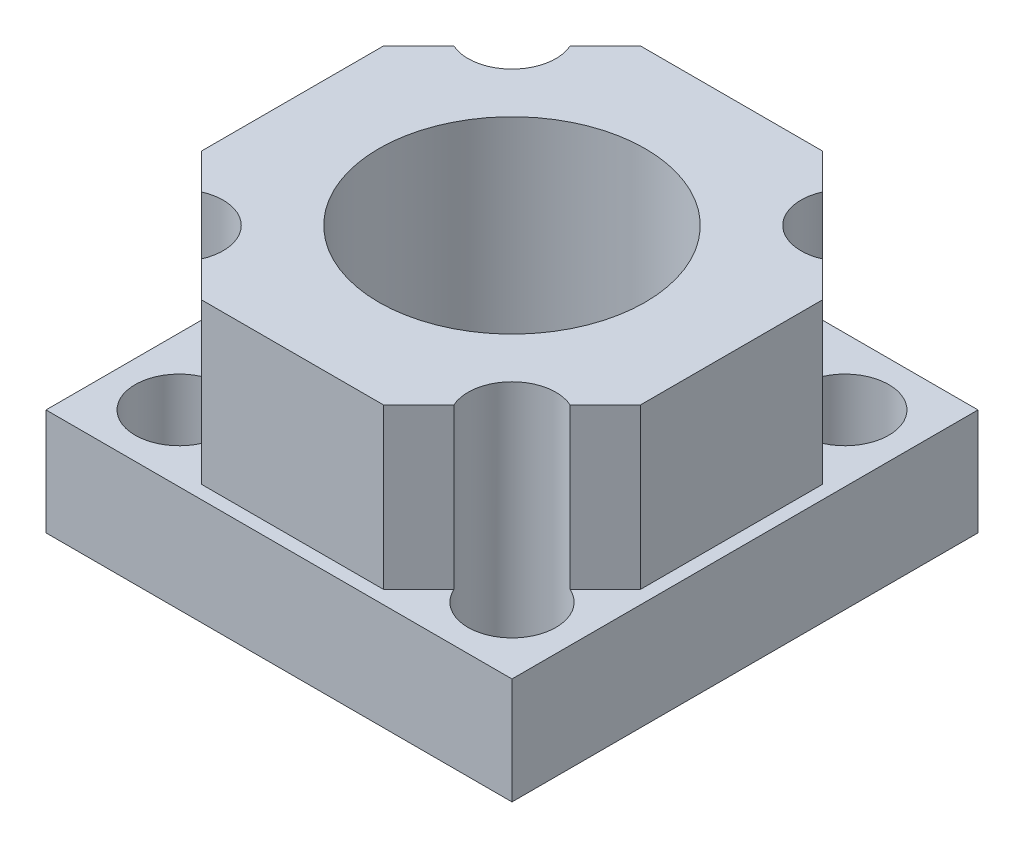
ISO-10303-21;
HEADER;
FILE_DESCRIPTION(('STEP AP214'),'2;1');
FILE_NAME('part.step','',(''),(''),'','','');
FILE_SCHEMA(('AUTOMOTIVE_DESIGN { 1 0 10303 214 1 1 1 1 }'));
ENDSEC;
DATA;
#1=APPLICATION_CONTEXT('core data for automotive mechanical design processes');
#2=APPLICATION_PROTOCOL_DEFINITION('international standard','automotive_design',2000,#1);
#3=PRODUCT_CONTEXT('',#1,'mechanical');
#4=PRODUCT('Part','Part','',(#3));
#5=PRODUCT_RELATED_PRODUCT_CATEGORY('part','',(#4));
#6=PRODUCT_DEFINITION_FORMATION('','',#4);
#7=PRODUCT_DEFINITION_CONTEXT('part definition',#1,'design');
#8=PRODUCT_DEFINITION('design','',#6,#7);
#9=PRODUCT_DEFINITION_SHAPE('','',#8);
#10=(LENGTH_UNIT() NAMED_UNIT(*) SI_UNIT(.MILLI.,.METRE.));
#11=(NAMED_UNIT(*) PLANE_ANGLE_UNIT() SI_UNIT($,.RADIAN.));
#12=(NAMED_UNIT(*) SI_UNIT($,.STERADIAN.) SOLID_ANGLE_UNIT());
#13=UNCERTAINTY_MEASURE_WITH_UNIT(LENGTH_MEASURE(1.E-05),#10,'distance_accuracy_value','');
#14=(GEOMETRIC_REPRESENTATION_CONTEXT(3) GLOBAL_UNCERTAINTY_ASSIGNED_CONTEXT((#13)) GLOBAL_UNIT_ASSIGNED_CONTEXT((#10,
#11,#12)) REPRESENTATION_CONTEXT('',''));
#15=CARTESIAN_POINT('',(0.,0.,0.));
#16=DIRECTION('',(0.,0.,1.));
#17=DIRECTION('',(1.,0.,0.));
#18=AXIS2_PLACEMENT_3D('',#15,#16,#17);
#19=CARTESIAN_POINT('',(-11.667261889578,12.,11.667261889578));
#20=DIRECTION('',(0.707106781186547,0.,-0.707106781186547));
#21=DIRECTION('',(-0.707106781186548,0.,-0.707106781186548));
#22=AXIS2_PLACEMENT_3D('',#19,#20,#21);
#23=PLANE('',#22);
#24=DIRECTION('',(0.707106781186548,0.,0.707106781186548));
#25=VECTOR('',#24,1.);
#26=CARTESIAN_POINT('',(-11.667261889578,12.,11.667261889578));
#27=LINE('',#26,#25);
#28=CARTESIAN_POINT('',(-9.48745748563468,12.,13.8470662935214));
#29=VERTEX_POINT('',#28);
#30=CARTESIAN_POINT('',(-6.83452377915607,12.,16.5));
#31=VERTEX_POINT('',#30);
#32=EDGE_CURVE('E189',#29,#31,#27,.T.);
#33=ORIENTED_EDGE('',*,*,#32,.F.);
#34=DIRECTION('',(0.,-1.,0.));
#35=VECTOR('',#34,1.);
#36=CARTESIAN_POINT('',(-9.48745748563468,12.,13.8470662935214));
#37=LINE('',#36,#35);
#38=CARTESIAN_POINT('',(-9.48745748563468,0.,13.8470662935214));
#39=VERTEX_POINT('',#38);
#40=EDGE_CURVE('E176',#29,#39,#37,.T.);
#41=ORIENTED_EDGE('',*,*,#40,.T.);
#42=DIRECTION('',(0.707106781186548,0.,0.707106781186548));
#43=VECTOR('',#42,1.);
#44=CARTESIAN_POINT('',(-11.667261889578,0.,11.667261889578));
#45=LINE('',#44,#43);
#46=CARTESIAN_POINT('',(-6.83452377915607,0.,16.5));
#47=VERTEX_POINT('',#46);
#48=EDGE_CURVE('E232',#39,#47,#45,.T.);
#49=ORIENTED_EDGE('',*,*,#48,.T.);
#50=DIRECTION('',(0.,-1.,0.));
#51=VECTOR('',#50,1.);
#52=CARTESIAN_POINT('',(-6.83452377915607,12.,16.5));
#53=LINE('',#52,#51);
#54=EDGE_CURVE('E197',#31,#47,#53,.T.);
#55=ORIENTED_EDGE('',*,*,#54,.F.);
#56=EDGE_LOOP('',(#33,#41,#49,#55));
#57=FACE_BOUND('',#56,.T.);
#58=ADVANCED_FACE('F39',(#57),#23,.F.);
#59=CARTESIAN_POINT('',(11.667261889578,12.,11.667261889578));
#60=DIRECTION('',(-0.707106781186548,0.,-0.707106781186547));
#61=DIRECTION('',(-0.707106781186547,0.,0.707106781186548));
#62=AXIS2_PLACEMENT_3D('',#59,#60,#61);
#63=PLANE('',#62);
#64=DIRECTION('',(0.707106781186547,0.,-0.707106781186548));
#65=VECTOR('',#64,1.);
#66=CARTESIAN_POINT('',(11.667261889578,12.,11.667261889578));
#67=LINE('',#66,#65);
#68=CARTESIAN_POINT('',(13.8470662935214,12.,9.48745748563468));
#69=VERTEX_POINT('',#68);
#70=CARTESIAN_POINT('',(16.5,12.,6.83452377915607));
#71=VERTEX_POINT('',#70);
#72=EDGE_CURVE('E209',#69,#71,#67,.T.);
#73=ORIENTED_EDGE('',*,*,#72,.F.);
#74=DIRECTION('',(0.,-1.,0.));
#75=VECTOR('',#74,1.);
#76=CARTESIAN_POINT('',(13.8470662935214,12.,9.48745748563468));
#77=LINE('',#76,#75);
#78=CARTESIAN_POINT('',(13.8470662935214,0.,9.48745748563468));
#79=VERTEX_POINT('',#78);
#80=EDGE_CURVE('E418',#69,#79,#77,.T.);
#81=ORIENTED_EDGE('',*,*,#80,.T.);
#82=DIRECTION('',(0.707106781186547,0.,-0.707106781186548));
#83=VECTOR('',#82,1.);
#84=CARTESIAN_POINT('',(11.667261889578,0.,11.667261889578));
#85=LINE('',#84,#83);
#86=CARTESIAN_POINT('',(16.5,0.,6.83452377915607));
#87=VERTEX_POINT('',#86);
#88=EDGE_CURVE('E235',#79,#87,#85,.T.);
#89=ORIENTED_EDGE('',*,*,#88,.T.);
#90=DIRECTION('',(0.,-1.,0.));
#91=VECTOR('',#90,1.);
#92=CARTESIAN_POINT('',(16.5,12.,6.83452377915607));
#93=LINE('',#92,#91);
#94=EDGE_CURVE('E266',#71,#87,#93,.T.);
#95=ORIENTED_EDGE('',*,*,#94,.F.);
#96=EDGE_LOOP('',(#73,#81,#89,#95));
#97=FACE_BOUND('',#96,.T.);
#98=ADVANCED_FACE('F327',(#97),#63,.F.);
#99=CARTESIAN_POINT('',(11.667261889578,12.,-11.667261889578));
#100=DIRECTION('',(-0.707106781186547,0.,0.707106781186548));
#101=DIRECTION('',(0.707106781186548,0.,0.707106781186547));
#102=AXIS2_PLACEMENT_3D('',#99,#100,#101);
#103=PLANE('',#102);
#104=DIRECTION('',(-0.707106781186548,0.,-0.707106781186547));
#105=VECTOR('',#104,1.);
#106=CARTESIAN_POINT('',(11.667261889578,12.,-11.667261889578));
#107=LINE('',#106,#105);
#108=CARTESIAN_POINT('',(9.48745748563467,12.,-13.8470662935214));
#109=VERTEX_POINT('',#108);
#110=CARTESIAN_POINT('',(6.83452377915606,12.,-16.5));
#111=VERTEX_POINT('',#110);
#112=EDGE_CURVE('E215',#109,#111,#107,.T.);
#113=ORIENTED_EDGE('',*,*,#112,.F.);
#114=DIRECTION('',(0.,-1.,0.));
#115=VECTOR('',#114,1.);
#116=CARTESIAN_POINT('',(9.48745748563467,12.,-13.8470662935214));
#117=LINE('',#116,#115);
#118=CARTESIAN_POINT('',(9.48745748563467,0.,-13.8470662935214));
#119=VERTEX_POINT('',#118);
#120=EDGE_CURVE('E378',#109,#119,#117,.T.);
#121=ORIENTED_EDGE('',*,*,#120,.T.);
#122=DIRECTION('',(-0.707106781186548,0.,-0.707106781186547));
#123=VECTOR('',#122,1.);
#124=CARTESIAN_POINT('',(11.667261889578,0.,-11.667261889578));
#125=LINE('',#124,#123);
#126=CARTESIAN_POINT('',(6.83452377915606,0.,-16.5));
#127=VERTEX_POINT('',#126);
#128=EDGE_CURVE('E242',#119,#127,#125,.T.);
#129=ORIENTED_EDGE('',*,*,#128,.T.);
#130=DIRECTION('',(0.,-1.,0.));
#131=VECTOR('',#130,1.);
#132=CARTESIAN_POINT('',(6.83452377915606,12.,-16.5));
#133=LINE('',#132,#131);
#134=EDGE_CURVE('E260',#111,#127,#133,.T.);
#135=ORIENTED_EDGE('',*,*,#134,.F.);
#136=EDGE_LOOP('',(#113,#121,#129,#135));
#137=FACE_BOUND('',#136,.T.);
#138=ADVANCED_FACE('F333',(#137),#103,.F.);
#139=CARTESIAN_POINT('',(-11.667261889578,12.,-11.667261889578));
#140=DIRECTION('',(0.707106781186548,0.,0.707106781186547));
#141=DIRECTION('',(0.707106781186547,0.,-0.707106781186548));
#142=AXIS2_PLACEMENT_3D('',#139,#140,#141);
#143=PLANE('',#142);
#144=DIRECTION('',(-0.707106781186547,0.,0.707106781186548));
#145=VECTOR('',#144,1.);
#146=CARTESIAN_POINT('',(-11.667261889578,12.,-11.667261889578));
#147=LINE('',#146,#145);
#148=CARTESIAN_POINT('',(-13.8470662935214,12.,-9.48745748563468));
#149=VERTEX_POINT('',#148);
#150=CARTESIAN_POINT('',(-16.5,12.,-6.83452377915606));
#151=VERTEX_POINT('',#150);
#152=EDGE_CURVE('E221',#149,#151,#147,.T.);
#153=ORIENTED_EDGE('',*,*,#152,.F.);
#154=DIRECTION('',(0.,-1.,0.));
#155=VECTOR('',#154,1.);
#156=CARTESIAN_POINT('',(-13.8470662935214,12.,-9.48745748563468));
#157=LINE('',#156,#155);
#158=CARTESIAN_POINT('',(-13.8470662935214,0.,-9.48745748563468));
#159=VERTEX_POINT('',#158);
#160=EDGE_CURVE('E359',#149,#159,#157,.T.);
#161=ORIENTED_EDGE('',*,*,#160,.T.);
#162=DIRECTION('',(-0.707106781186547,0.,0.707106781186548));
#163=VECTOR('',#162,1.);
#164=CARTESIAN_POINT('',(-11.667261889578,0.,-11.667261889578));
#165=LINE('',#164,#163);
#166=CARTESIAN_POINT('',(-16.5,0.,-6.83452377915606));
#167=VERTEX_POINT('',#166);
#168=EDGE_CURVE('E249',#159,#167,#165,.T.);
#169=ORIENTED_EDGE('',*,*,#168,.T.);
#170=DIRECTION('',(0.,-1.,0.));
#171=VECTOR('',#170,1.);
#172=CARTESIAN_POINT('',(-16.5,12.,-6.83452377915606));
#173=LINE('',#172,#171);
#174=EDGE_CURVE('E254',#151,#167,#173,.T.);
#175=ORIENTED_EDGE('',*,*,#174,.F.);
#176=EDGE_LOOP('',(#153,#161,#169,#175));
#177=FACE_BOUND('',#176,.T.);
#178=ADVANCED_FACE('F358',(#177),#143,.F.);
#179=CARTESIAN_POINT('',(17.5,-8.,0.));
#180=DIRECTION('',(-1.,0.,0.));
#181=DIRECTION('',(0.,0.,1.));
#182=AXIS2_PLACEMENT_3D('',#179,#180,#181);
#183=PLANE('',#182);
#184=DIRECTION('',(0.,0.,1.));
#185=VECTOR('',#184,1.);
#186=CARTESIAN_POINT('',(17.5,0.,0.));
#187=LINE('',#186,#185);
#188=CARTESIAN_POINT('',(17.5,0.,-17.5));
#189=VERTEX_POINT('',#188);
#190=CARTESIAN_POINT('',(17.5,0.,17.5));
#191=VERTEX_POINT('',#190);
#192=EDGE_CURVE('E273',#189,#191,#187,.T.);
#193=ORIENTED_EDGE('',*,*,#192,.T.);
#194=DIRECTION('',(0.,1.,0.));
#195=VECTOR('',#194,1.);
#196=CARTESIAN_POINT('',(17.5,-8.,17.5));
#197=LINE('',#196,#195);
#198=CARTESIAN_POINT('',(17.5,-8.,17.5));
#199=VERTEX_POINT('',#198);
#200=EDGE_CURVE('E11',#199,#191,#197,.T.);
#201=ORIENTED_EDGE('',*,*,#200,.F.);
#202=DIRECTION('',(0.,0.,1.));
#203=VECTOR('',#202,1.);
#204=CARTESIAN_POINT('',(17.5,-8.,0.));
#205=LINE('',#204,#203);
#206=CARTESIAN_POINT('',(17.5,-8.,-17.5));
#207=VERTEX_POINT('',#206);
#208=EDGE_CURVE('E274',#207,#199,#205,.T.);
#209=ORIENTED_EDGE('',*,*,#208,.F.);
#210=DIRECTION('',(0.,1.,0.));
#211=VECTOR('',#210,1.);
#212=CARTESIAN_POINT('',(17.5,-8.,-17.5));
#213=LINE('',#212,#211);
#214=EDGE_CURVE('E43',#207,#189,#213,.T.);
#215=ORIENTED_EDGE('',*,*,#214,.T.);
#216=EDGE_LOOP('',(#193,#201,#209,#215));
#217=FACE_BOUND('',#216,.T.);
#218=ADVANCED_FACE('F41',(#217),#183,.F.);
#219=CARTESIAN_POINT('',(0.,-8.,17.5));
#220=DIRECTION('',(0.,0.,1.));
#221=DIRECTION('',(1.,0.,0.));
#222=AXIS2_PLACEMENT_3D('',#219,#220,#221);
#223=PLANE('',#222);
#224=DIRECTION('',(1.,0.,0.));
#225=VECTOR('',#224,1.);
#226=CARTESIAN_POINT('',(0.,0.,17.5));
#227=LINE('',#226,#225);
#228=CARTESIAN_POINT('',(-17.5,0.,17.5));
#229=VERTEX_POINT('',#228);
#230=EDGE_CURVE('E277',#229,#191,#227,.T.);
#231=ORIENTED_EDGE('',*,*,#230,.F.);
#232=DIRECTION('',(0.,1.,0.));
#233=VECTOR('',#232,1.);
#234=CARTESIAN_POINT('',(-17.5,-8.,17.5));
#235=LINE('',#234,#233);
#236=CARTESIAN_POINT('',(-17.5,-8.,17.5));
#237=VERTEX_POINT('',#236);
#238=EDGE_CURVE('E48',#237,#229,#235,.T.);
#239=ORIENTED_EDGE('',*,*,#238,.F.);
#240=DIRECTION('',(1.,0.,0.));
#241=VECTOR('',#240,1.);
#242=CARTESIAN_POINT('',(0.,-8.,17.5));
#243=LINE('',#242,#241);
#244=EDGE_CURVE('E282',#237,#199,#243,.T.);
#245=ORIENTED_EDGE('',*,*,#244,.T.);
#246=ORIENTED_EDGE('',*,*,#200,.T.);
#247=EDGE_LOOP('',(#231,#239,#245,#246));
#248=FACE_BOUND('',#247,.T.);
#249=ADVANCED_FACE('F309',(#248),#223,.T.);
#250=CARTESIAN_POINT('',(-17.5,-8.,0.));
#251=DIRECTION('',(-1.,0.,0.));
#252=DIRECTION('',(0.,0.,1.));
#253=AXIS2_PLACEMENT_3D('',#250,#251,#252);
#254=PLANE('',#253);
#255=DIRECTION('',(0.,0.,1.));
#256=VECTOR('',#255,1.);
#257=CARTESIAN_POINT('',(-17.5,0.,0.));
#258=LINE('',#257,#256);
#259=CARTESIAN_POINT('',(-17.5,0.,-17.5));
#260=VERTEX_POINT('',#259);
#261=EDGE_CURVE('E289',#260,#229,#258,.T.);
#262=ORIENTED_EDGE('',*,*,#261,.F.);
#263=DIRECTION('',(0.,1.,0.));
#264=VECTOR('',#263,1.);
#265=CARTESIAN_POINT('',(-17.5,-8.,-17.5));
#266=LINE('',#265,#264);
#267=CARTESIAN_POINT('',(-17.5,-8.,-17.5));
#268=VERTEX_POINT('',#267);
#269=EDGE_CURVE('E294',#268,#260,#266,.T.);
#270=ORIENTED_EDGE('',*,*,#269,.F.);
#271=DIRECTION('',(0.,0.,1.));
#272=VECTOR('',#271,1.);
#273=CARTESIAN_POINT('',(-17.5,-8.,0.));
#274=LINE('',#273,#272);
#275=EDGE_CURVE('E279',#268,#237,#274,.T.);
#276=ORIENTED_EDGE('',*,*,#275,.T.);
#277=ORIENTED_EDGE('',*,*,#238,.T.);
#278=EDGE_LOOP('',(#262,#270,#276,#277));
#279=FACE_BOUND('',#278,.T.);
#280=ADVANCED_FACE('F316',(#279),#254,.T.);
#281=CARTESIAN_POINT('',(0.,-8.,-17.5));
#282=DIRECTION('',(0.,0.,1.));
#283=DIRECTION('',(1.,0.,0.));
#284=AXIS2_PLACEMENT_3D('',#281,#282,#283);
#285=PLANE('',#284);
#286=DIRECTION('',(1.,0.,0.));
#287=VECTOR('',#286,1.);
#288=CARTESIAN_POINT('',(0.,0.,-17.5));
#289=LINE('',#288,#287);
#290=EDGE_CURVE('E287',#260,#189,#289,.T.);
#291=ORIENTED_EDGE('',*,*,#290,.T.);
#292=ORIENTED_EDGE('',*,*,#214,.F.);
#293=DIRECTION('',(1.,0.,0.));
#294=VECTOR('',#293,1.);
#295=CARTESIAN_POINT('',(0.,-8.,-17.5));
#296=LINE('',#295,#294);
#297=EDGE_CURVE('E276',#268,#207,#296,.T.);
#298=ORIENTED_EDGE('',*,*,#297,.F.);
#299=ORIENTED_EDGE('',*,*,#269,.T.);
#300=EDGE_LOOP('',(#291,#292,#298,#299));
#301=FACE_BOUND('',#300,.T.);
#302=ADVANCED_FACE('F314',(#301),#285,.F.);
#303=CARTESIAN_POINT('',(0.,-8.,0.));
#304=DIRECTION('',(0.,1.,0.));
#305=DIRECTION('',(0.,0.,1.));
#306=AXIS2_PLACEMENT_3D('',#303,#304,#305);
#307=PLANE('',#306);
#308=CARTESIAN_POINT('',(12.5,-8.,12.5));
#309=DIRECTION('',(0.,1.,0.));
#310=DIRECTION('',(0.,0.,1.));
#311=AXIS2_PLACEMENT_3D('',#308,#309,#310);
#312=CIRCLE('',#311,3.3);
#313=CARTESIAN_POINT('',(12.5,-8.,15.8));
#314=VERTEX_POINT('',#313);
#315=EDGE_CURVE('E427',#314,#314,#312,.T.);
#316=ORIENTED_EDGE('',*,*,#315,.T.);
#317=EDGE_LOOP('',(#316));
#318=FACE_BOUND('',#317,.T.);
#319=CARTESIAN_POINT('',(-12.5,-8.,12.5));
#320=DIRECTION('',(0.,1.,0.));
#321=DIRECTION('',(0.,0.,1.));
#322=AXIS2_PLACEMENT_3D('',#319,#320,#321);
#323=CIRCLE('',#322,3.3);
#324=CARTESIAN_POINT('',(-12.5,-8.,15.8));
#325=VERTEX_POINT('',#324);
#326=EDGE_CURVE('E387',#325,#325,#323,.T.);
#327=ORIENTED_EDGE('',*,*,#326,.T.);
#328=EDGE_LOOP('',(#327));
#329=FACE_BOUND('',#328,.T.);
#330=CARTESIAN_POINT('',(12.5,-8.,-12.5));
#331=DIRECTION('',(0.,1.,0.));
#332=DIRECTION('',(0.,0.,1.));
#333=AXIS2_PLACEMENT_3D('',#330,#331,#332);
#334=CIRCLE('',#333,3.3);
#335=CARTESIAN_POINT('',(12.5,-8.,-9.2));
#336=VERTEX_POINT('',#335);
#337=EDGE_CURVE('E386',#336,#336,#334,.T.);
#338=ORIENTED_EDGE('',*,*,#337,.T.);
#339=EDGE_LOOP('',(#338));
#340=FACE_BOUND('',#339,.T.);
#341=CARTESIAN_POINT('',(-12.5,-8.,-12.5));
#342=DIRECTION('',(0.,1.,0.));
#343=DIRECTION('',(0.,0.,1.));
#344=AXIS2_PLACEMENT_3D('',#341,#342,#343);
#345=CIRCLE('',#344,3.3);
#346=CARTESIAN_POINT('',(-12.5,-8.,-9.2));
#347=VERTEX_POINT('',#346);
#348=EDGE_CURVE('E362',#347,#347,#345,.T.);
#349=ORIENTED_EDGE('',*,*,#348,.T.);
#350=EDGE_LOOP('',(#349));
#351=FACE_BOUND('',#350,.T.);
#352=CARTESIAN_POINT('',(0.,-8.,0.));
#353=DIRECTION('',(0.,1.,0.));
#354=DIRECTION('',(0.,0.,1.));
#355=AXIS2_PLACEMENT_3D('',#352,#353,#354);
#356=CIRCLE('',#355,10.);
#357=CARTESIAN_POINT('',(0.,-8.,10.));
#358=VERTEX_POINT('',#357);
#359=EDGE_CURVE('E206',#358,#358,#356,.T.);
#360=ORIENTED_EDGE('',*,*,#359,.T.);
#361=EDGE_LOOP('',(#360));
#362=FACE_BOUND('',#361,.T.);
#363=ORIENTED_EDGE('',*,*,#208,.T.);
#364=ORIENTED_EDGE('',*,*,#244,.F.);
#365=ORIENTED_EDGE('',*,*,#275,.F.);
#366=ORIENTED_EDGE('',*,*,#297,.T.);
#367=EDGE_LOOP('',(#363,#364,#365,#366));
#368=FACE_BOUND('',#367,.T.);
#369=ADVANCED_FACE('F313',(#318,#329,#340,#351,#362,#368),#307,.F.);
#370=CARTESIAN_POINT('',(0.,0.,0.));
#371=DIRECTION('',(0.,1.,0.));
#372=DIRECTION('',(0.,0.,1.));
#373=AXIS2_PLACEMENT_3D('',#370,#371,#372);
#374=PLANE('',#373);
#375=CARTESIAN_POINT('',(12.5,0.,12.5));
#376=DIRECTION('',(0.,1.,0.));
#377=DIRECTION('',(0.,0.,1.));
#378=AXIS2_PLACEMENT_3D('',#375,#376,#377);
#379=CIRCLE('',#378,3.3);
#380=CARTESIAN_POINT('',(9.48745748563468,0.,13.8470662935214));
#381=VERTEX_POINT('',#380);
#382=EDGE_CURVE('E425',#381,#79,#379,.T.);
#383=ORIENTED_EDGE('',*,*,#382,.F.);
#384=CARTESIAN_POINT('',(6.83452377915607,0.,16.5));
#385=VERTEX_POINT('',#384);
#386=EDGE_CURVE('E236',#385,#381,#85,.T.);
#387=ORIENTED_EDGE('',*,*,#386,.F.);
#388=DIRECTION('',(1.,0.,0.));
#389=VECTOR('',#388,1.);
#390=CARTESIAN_POINT('',(0.,0.,16.5));
#391=LINE('',#390,#389);
#392=EDGE_CURVE('E231',#47,#385,#391,.T.);
#393=ORIENTED_EDGE('',*,*,#392,.F.);
#394=ORIENTED_EDGE('',*,*,#48,.F.);
#395=CARTESIAN_POINT('',(-12.5,0.,12.5));
#396=DIRECTION('',(0.,1.,0.));
#397=DIRECTION('',(0.,0.,1.));
#398=AXIS2_PLACEMENT_3D('',#395,#396,#397);
#399=CIRCLE('',#398,3.3);
#400=CARTESIAN_POINT('',(-13.8470662935214,0.,9.48745748563468));
#401=VERTEX_POINT('',#400);
#402=EDGE_CURVE('E180',#401,#39,#399,.T.);
#403=ORIENTED_EDGE('',*,*,#402,.F.);
#404=CARTESIAN_POINT('',(-16.5,0.,6.83452377915608));
#405=VERTEX_POINT('',#404);
#406=EDGE_CURVE('E228',#405,#401,#45,.T.);
#407=ORIENTED_EDGE('',*,*,#406,.F.);
#408=DIRECTION('',(0.,0.,1.));
#409=VECTOR('',#408,1.);
#410=CARTESIAN_POINT('',(-16.5,0.,0.));
#411=LINE('',#410,#409);
#412=EDGE_CURVE('E198',#167,#405,#411,.T.);
#413=ORIENTED_EDGE('',*,*,#412,.F.);
#414=ORIENTED_EDGE('',*,*,#168,.F.);
#415=CARTESIAN_POINT('',(-12.5,0.,-12.5));
#416=DIRECTION('',(0.,1.,0.));
#417=DIRECTION('',(0.,0.,1.));
#418=AXIS2_PLACEMENT_3D('',#415,#416,#417);
#419=CIRCLE('',#418,3.3);
#420=CARTESIAN_POINT('',(-9.48745748563468,0.,-13.8470662935214));
#421=VERTEX_POINT('',#420);
#422=EDGE_CURVE('E360',#421,#159,#419,.T.);
#423=ORIENTED_EDGE('',*,*,#422,.F.);
#424=CARTESIAN_POINT('',(-6.83452377915607,0.,-16.5));
#425=VERTEX_POINT('',#424);
#426=EDGE_CURVE('E202',#425,#421,#165,.T.);
#427=ORIENTED_EDGE('',*,*,#426,.F.);
#428=DIRECTION('',(-1.,0.,0.));
#429=VECTOR('',#428,1.);
#430=CARTESIAN_POINT('',(0.,0.,-16.5));
#431=LINE('',#430,#429);
#432=EDGE_CURVE('E246',#127,#425,#431,.T.);
#433=ORIENTED_EDGE('',*,*,#432,.F.);
#434=ORIENTED_EDGE('',*,*,#128,.F.);
#435=CARTESIAN_POINT('',(12.5,0.,-12.5));
#436=DIRECTION('',(0.,1.,0.));
#437=DIRECTION('',(0.,0.,1.));
#438=AXIS2_PLACEMENT_3D('',#435,#436,#437);
#439=CIRCLE('',#438,3.3);
#440=CARTESIAN_POINT('',(13.8470662935214,0.,-9.48745748563468));
#441=VERTEX_POINT('',#440);
#442=EDGE_CURVE('E375',#441,#119,#439,.T.);
#443=ORIENTED_EDGE('',*,*,#442,.F.);
#444=CARTESIAN_POINT('',(16.5,0.,-6.83452377915606));
#445=VERTEX_POINT('',#444);
#446=EDGE_CURVE('E243',#445,#441,#125,.T.);
#447=ORIENTED_EDGE('',*,*,#446,.F.);
#448=DIRECTION('',(0.,0.,-1.));
#449=VECTOR('',#448,1.);
#450=CARTESIAN_POINT('',(16.5,0.,0.));
#451=LINE('',#450,#449);
#452=EDGE_CURVE('E239',#87,#445,#451,.T.);
#453=ORIENTED_EDGE('',*,*,#452,.F.);
#454=ORIENTED_EDGE('',*,*,#88,.F.);
#455=EDGE_LOOP('',(#383,#387,#393,#394,#403,#407,#413,#414,#423,#427,#433,#434,#443,#447,#453,#454));
#456=FACE_BOUND('',#455,.T.);
#457=ORIENTED_EDGE('',*,*,#192,.F.);
#458=ORIENTED_EDGE('',*,*,#290,.F.);
#459=ORIENTED_EDGE('',*,*,#261,.T.);
#460=ORIENTED_EDGE('',*,*,#230,.T.);
#461=EDGE_LOOP('',(#457,#458,#459,#460));
#462=FACE_BOUND('',#461,.T.);
#463=ADVANCED_FACE('F305',(#456,#462),#374,.T.);
#464=ORIENTED_EDGE('',*,*,#406,.T.);
#465=DIRECTION('',(0.,-1.,0.));
#466=VECTOR('',#465,1.);
#467=CARTESIAN_POINT('',(-13.8470662935214,12.,9.48745748563468));
#468=LINE('',#467,#466);
#469=CARTESIAN_POINT('',(-13.8470662935214,12.,9.48745748563468));
#470=VERTEX_POINT('',#469);
#471=EDGE_CURVE('E56',#470,#401,#468,.T.);
#472=ORIENTED_EDGE('',*,*,#471,.F.);
#473=CARTESIAN_POINT('',(-16.5,12.,6.83452377915608));
#474=VERTEX_POINT('',#473);
#475=EDGE_CURVE('E192',#474,#470,#27,.T.);
#476=ORIENTED_EDGE('',*,*,#475,.F.);
#477=DIRECTION('',(0.,-1.,0.));
#478=VECTOR('',#477,1.);
#479=CARTESIAN_POINT('',(-16.5,12.,6.83452377915608));
#480=LINE('',#479,#478);
#481=EDGE_CURVE('E227',#474,#405,#480,.T.);
#482=ORIENTED_EDGE('',*,*,#481,.T.);
#483=EDGE_LOOP('',(#464,#472,#476,#482));
#484=FACE_BOUND('',#483,.T.);
#485=ADVANCED_FACE('F329',(#484),#23,.F.);
#486=CARTESIAN_POINT('',(0.,12.,16.5));
#487=DIRECTION('',(0.,0.,-1.));
#488=DIRECTION('',(-1.,0.,0.));
#489=AXIS2_PLACEMENT_3D('',#486,#487,#488);
#490=PLANE('',#489);
#491=ORIENTED_EDGE('',*,*,#392,.T.);
#492=DIRECTION('',(0.,-1.,0.));
#493=VECTOR('',#492,1.);
#494=CARTESIAN_POINT('',(6.83452377915607,12.,16.5));
#495=LINE('',#494,#493);
#496=CARTESIAN_POINT('',(6.83452377915607,12.,16.5));
#497=VERTEX_POINT('',#496);
#498=EDGE_CURVE('E269',#497,#385,#495,.T.);
#499=ORIENTED_EDGE('',*,*,#498,.F.);
#500=DIRECTION('',(1.,0.,0.));
#501=VECTOR('',#500,1.);
#502=CARTESIAN_POINT('',(0.,12.,16.5));
#503=LINE('',#502,#501);
#504=EDGE_CURVE('E200',#31,#497,#503,.T.);
#505=ORIENTED_EDGE('',*,*,#504,.F.);
#506=ORIENTED_EDGE('',*,*,#54,.T.);
#507=EDGE_LOOP('',(#491,#499,#505,#506));
#508=FACE_BOUND('',#507,.T.);
#509=ADVANCED_FACE('F339',(#508),#490,.F.);
#510=ORIENTED_EDGE('',*,*,#386,.T.);
#511=DIRECTION('',(0.,-1.,0.));
#512=VECTOR('',#511,1.);
#513=CARTESIAN_POINT('',(9.48745748563468,12.,13.8470662935214));
#514=LINE('',#513,#512);
#515=CARTESIAN_POINT('',(9.48745748563468,12.,13.8470662935214));
#516=VERTEX_POINT('',#515);
#517=EDGE_CURVE('E415',#516,#381,#514,.T.);
#518=ORIENTED_EDGE('',*,*,#517,.F.);
#519=EDGE_CURVE('E210',#497,#516,#67,.T.);
#520=ORIENTED_EDGE('',*,*,#519,.F.);
#521=ORIENTED_EDGE('',*,*,#498,.T.);
#522=EDGE_LOOP('',(#510,#518,#520,#521));
#523=FACE_BOUND('',#522,.T.);
#524=ADVANCED_FACE('F336',(#523),#63,.F.);
#525=CARTESIAN_POINT('',(16.5,12.,0.));
#526=DIRECTION('',(-1.,0.,0.));
#527=DIRECTION('',(0.,0.,1.));
#528=AXIS2_PLACEMENT_3D('',#525,#526,#527);
#529=PLANE('',#528);
#530=ORIENTED_EDGE('',*,*,#452,.T.);
#531=DIRECTION('',(0.,-1.,0.));
#532=VECTOR('',#531,1.);
#533=CARTESIAN_POINT('',(16.5,12.,-6.83452377915606));
#534=LINE('',#533,#532);
#535=CARTESIAN_POINT('',(16.5,12.,-6.83452377915606));
#536=VERTEX_POINT('',#535);
#537=EDGE_CURVE('E263',#536,#445,#534,.T.);
#538=ORIENTED_EDGE('',*,*,#537,.F.);
#539=DIRECTION('',(0.,0.,-1.));
#540=VECTOR('',#539,1.);
#541=CARTESIAN_POINT('',(16.5,12.,0.));
#542=LINE('',#541,#540);
#543=EDGE_CURVE('E213',#71,#536,#542,.T.);
#544=ORIENTED_EDGE('',*,*,#543,.F.);
#545=ORIENTED_EDGE('',*,*,#94,.T.);
#546=EDGE_LOOP('',(#530,#538,#544,#545));
#547=FACE_BOUND('',#546,.T.);
#548=ADVANCED_FACE('F442',(#547),#529,.F.);
#549=ORIENTED_EDGE('',*,*,#446,.T.);
#550=DIRECTION('',(0.,-1.,0.));
#551=VECTOR('',#550,1.);
#552=CARTESIAN_POINT('',(13.8470662935214,12.,-9.48745748563468));
#553=LINE('',#552,#551);
#554=CARTESIAN_POINT('',(13.8470662935214,12.,-9.48745748563468));
#555=VERTEX_POINT('',#554);
#556=EDGE_CURVE('E382',#555,#441,#553,.T.);
#557=ORIENTED_EDGE('',*,*,#556,.F.);
#558=EDGE_CURVE('E216',#536,#555,#107,.T.);
#559=ORIENTED_EDGE('',*,*,#558,.F.);
#560=ORIENTED_EDGE('',*,*,#537,.T.);
#561=EDGE_LOOP('',(#549,#557,#559,#560));
#562=FACE_BOUND('',#561,.T.);
#563=ADVANCED_FACE('F444',(#562),#103,.F.);
#564=CARTESIAN_POINT('',(0.,12.,-16.5));
#565=DIRECTION('',(0.,0.,1.));
#566=DIRECTION('',(1.,0.,0.));
#567=AXIS2_PLACEMENT_3D('',#564,#565,#566);
#568=PLANE('',#567);
#569=ORIENTED_EDGE('',*,*,#432,.T.);
#570=DIRECTION('',(0.,-1.,0.));
#571=VECTOR('',#570,1.);
#572=CARTESIAN_POINT('',(-6.83452377915607,12.,-16.5));
#573=LINE('',#572,#571);
#574=CARTESIAN_POINT('',(-6.83452377915607,12.,-16.5));
#575=VERTEX_POINT('',#574);
#576=EDGE_CURVE('E257',#575,#425,#573,.T.);
#577=ORIENTED_EDGE('',*,*,#576,.F.);
#578=DIRECTION('',(-1.,0.,0.));
#579=VECTOR('',#578,1.);
#580=CARTESIAN_POINT('',(0.,12.,-16.5));
#581=LINE('',#580,#579);
#582=EDGE_CURVE('E219',#111,#575,#581,.T.);
#583=ORIENTED_EDGE('',*,*,#582,.F.);
#584=ORIENTED_EDGE('',*,*,#134,.T.);
#585=EDGE_LOOP('',(#569,#577,#583,#584));
#586=FACE_BOUND('',#585,.T.);
#587=ADVANCED_FACE('F370',(#586),#568,.F.);
#588=ORIENTED_EDGE('',*,*,#426,.T.);
#589=DIRECTION('',(0.,-1.,0.));
#590=VECTOR('',#589,1.);
#591=CARTESIAN_POINT('',(-9.48745748563468,12.,-13.8470662935214));
#592=LINE('',#591,#590);
#593=CARTESIAN_POINT('',(-9.48745748563468,12.,-13.8470662935214));
#594=VERTEX_POINT('',#593);
#595=EDGE_CURVE('E64',#594,#421,#592,.T.);
#596=ORIENTED_EDGE('',*,*,#595,.F.);
#597=EDGE_CURVE('E222',#575,#594,#147,.T.);
#598=ORIENTED_EDGE('',*,*,#597,.F.);
#599=ORIENTED_EDGE('',*,*,#576,.T.);
#600=EDGE_LOOP('',(#588,#596,#598,#599));
#601=FACE_BOUND('',#600,.T.);
#602=ADVANCED_FACE('F365',(#601),#143,.F.);
#603=CARTESIAN_POINT('',(-16.5,12.,0.));
#604=DIRECTION('',(1.,0.,0.));
#605=DIRECTION('',(0.,0.,-1.));
#606=AXIS2_PLACEMENT_3D('',#603,#604,#605);
#607=PLANE('',#606);
#608=ORIENTED_EDGE('',*,*,#412,.T.);
#609=ORIENTED_EDGE('',*,*,#481,.F.);
#610=DIRECTION('',(0.,0.,1.));
#611=VECTOR('',#610,1.);
#612=CARTESIAN_POINT('',(-16.5,12.,0.));
#613=LINE('',#612,#611);
#614=EDGE_CURVE('E225',#151,#474,#613,.T.);
#615=ORIENTED_EDGE('',*,*,#614,.F.);
#616=ORIENTED_EDGE('',*,*,#174,.T.);
#617=EDGE_LOOP('',(#608,#609,#615,#616));
#618=FACE_BOUND('',#617,.T.);
#619=ADVANCED_FACE('F353',(#618),#607,.F.);
#620=CARTESIAN_POINT('',(0.,12.,0.));
#621=DIRECTION('',(0.,1.,0.));
#622=DIRECTION('',(0.,0.,1.));
#623=AXIS2_PLACEMENT_3D('',#620,#621,#622);
#624=PLANE('',#623);
#625=CARTESIAN_POINT('',(-12.5,12.,12.5));
#626=DIRECTION('',(0.,-1.,0.));
#627=DIRECTION('',(0.,0.,-1.));
#628=AXIS2_PLACEMENT_3D('',#625,#626,#627);
#629=CIRCLE('',#628,3.3);
#630=EDGE_CURVE('E179',#470,#29,#629,.T.);
#631=ORIENTED_EDGE('',*,*,#630,.T.);
#632=ORIENTED_EDGE('',*,*,#32,.T.);
#633=ORIENTED_EDGE('',*,*,#504,.T.);
#634=ORIENTED_EDGE('',*,*,#519,.T.);
#635=CARTESIAN_POINT('',(12.5,12.,12.5));
#636=DIRECTION('',(0.,-1.,0.));
#637=DIRECTION('',(0.,0.,-1.));
#638=AXIS2_PLACEMENT_3D('',#635,#636,#637);
#639=CIRCLE('',#638,3.3);
#640=EDGE_CURVE('E193',#516,#69,#639,.T.);
#641=ORIENTED_EDGE('',*,*,#640,.T.);
#642=ORIENTED_EDGE('',*,*,#72,.T.);
#643=ORIENTED_EDGE('',*,*,#543,.T.);
#644=ORIENTED_EDGE('',*,*,#558,.T.);
#645=CARTESIAN_POINT('',(12.5,12.,-12.5));
#646=DIRECTION('',(0.,-1.,0.));
#647=DIRECTION('',(0.,0.,-1.));
#648=AXIS2_PLACEMENT_3D('',#645,#646,#647);
#649=CIRCLE('',#648,3.3);
#650=EDGE_CURVE('E381',#555,#109,#649,.T.);
#651=ORIENTED_EDGE('',*,*,#650,.T.);
#652=ORIENTED_EDGE('',*,*,#112,.T.);
#653=ORIENTED_EDGE('',*,*,#582,.T.);
#654=ORIENTED_EDGE('',*,*,#597,.T.);
#655=CARTESIAN_POINT('',(-12.5,12.,-12.5));
#656=DIRECTION('',(0.,-1.,0.));
#657=DIRECTION('',(0.,0.,-1.));
#658=AXIS2_PLACEMENT_3D('',#655,#656,#657);
#659=CIRCLE('',#658,3.3);
#660=EDGE_CURVE('E390',#594,#149,#659,.T.);
#661=ORIENTED_EDGE('',*,*,#660,.T.);
#662=ORIENTED_EDGE('',*,*,#152,.T.);
#663=ORIENTED_EDGE('',*,*,#614,.T.);
#664=ORIENTED_EDGE('',*,*,#475,.T.);
#665=EDGE_LOOP('',(#631,#632,#633,#634,#641,#642,#643,#644,#651,#652,#653,#654,#661,#662,#663,#664));
#666=FACE_BOUND('',#665,.T.);
#667=CARTESIAN_POINT('',(0.,12.,0.));
#668=DIRECTION('',(0.,1.,0.));
#669=DIRECTION('',(0.,0.,1.));
#670=AXIS2_PLACEMENT_3D('',#667,#668,#669);
#671=CIRCLE('',#670,10.);
#672=CARTESIAN_POINT('',(0.,12.,10.));
#673=VERTEX_POINT('',#672);
#674=EDGE_CURVE('E401',#673,#673,#671,.T.);
#675=ORIENTED_EDGE('',*,*,#674,.F.);
#676=EDGE_LOOP('',(#675));
#677=FACE_BOUND('',#676,.T.);
#678=ADVANCED_FACE('F187',(#666,#677),#624,.T.);
#679=CARTESIAN_POINT('',(0.,12.,0.));
#680=DIRECTION('',(0.,1.,0.));
#681=DIRECTION('',(0.,0.,1.));
#682=AXIS2_PLACEMENT_3D('',#679,#680,#681);
#683=CYLINDRICAL_SURFACE('',#682,10.);
#684=ORIENTED_EDGE('',*,*,#359,.F.);
#685=EDGE_LOOP('',(#684));
#686=FACE_BOUND('',#685,.T.);
#687=ORIENTED_EDGE('',*,*,#674,.T.);
#688=EDGE_LOOP('',(#687));
#689=FACE_BOUND('',#688,.T.);
#690=ADVANCED_FACE('F471',(#686,#689),#683,.F.);
#691=CARTESIAN_POINT('',(-12.5,0.,-12.5));
#692=DIRECTION('',(0.,1.,0.));
#693=DIRECTION('',(0.,0.,1.));
#694=AXIS2_PLACEMENT_3D('',#691,#692,#693);
#695=CYLINDRICAL_SURFACE('',#694,3.3);
#696=ORIENTED_EDGE('',*,*,#348,.F.);
#697=EDGE_LOOP('',(#696));
#698=FACE_BOUND('',#697,.T.);
#699=ORIENTED_EDGE('',*,*,#422,.T.);
#700=ORIENTED_EDGE('',*,*,#160,.F.);
#701=ORIENTED_EDGE('',*,*,#660,.F.);
#702=ORIENTED_EDGE('',*,*,#595,.T.);
#703=EDGE_LOOP('',(#699,#700,#701,#702));
#704=FACE_BOUND('',#703,.T.);
#705=ADVANCED_FACE('F475',(#698,#704),#695,.F.);
#706=CARTESIAN_POINT('',(12.5,0.,-12.5));
#707=DIRECTION('',(0.,1.,0.));
#708=DIRECTION('',(0.,0.,1.));
#709=AXIS2_PLACEMENT_3D('',#706,#707,#708);
#710=CYLINDRICAL_SURFACE('',#709,3.3);
#711=ORIENTED_EDGE('',*,*,#337,.F.);
#712=EDGE_LOOP('',(#711));
#713=FACE_BOUND('',#712,.T.);
#714=ORIENTED_EDGE('',*,*,#442,.T.);
#715=ORIENTED_EDGE('',*,*,#120,.F.);
#716=ORIENTED_EDGE('',*,*,#650,.F.);
#717=ORIENTED_EDGE('',*,*,#556,.T.);
#718=EDGE_LOOP('',(#714,#715,#716,#717));
#719=FACE_BOUND('',#718,.T.);
#720=ADVANCED_FACE('F384',(#713,#719),#710,.F.);
#721=CARTESIAN_POINT('',(-12.5,0.,12.5));
#722=DIRECTION('',(0.,1.,0.));
#723=DIRECTION('',(0.,0.,1.));
#724=AXIS2_PLACEMENT_3D('',#721,#722,#723);
#725=CYLINDRICAL_SURFACE('',#724,3.3);
#726=ORIENTED_EDGE('',*,*,#326,.F.);
#727=EDGE_LOOP('',(#726));
#728=FACE_BOUND('',#727,.T.);
#729=ORIENTED_EDGE('',*,*,#402,.T.);
#730=ORIENTED_EDGE('',*,*,#40,.F.);
#731=ORIENTED_EDGE('',*,*,#630,.F.);
#732=ORIENTED_EDGE('',*,*,#471,.T.);
#733=EDGE_LOOP('',(#729,#730,#731,#732));
#734=FACE_BOUND('',#733,.T.);
#735=ADVANCED_FACE('F178',(#728,#734),#725,.F.);
#736=CARTESIAN_POINT('',(12.5,0.,12.5));
#737=DIRECTION('',(0.,1.,0.));
#738=DIRECTION('',(0.,0.,1.));
#739=AXIS2_PLACEMENT_3D('',#736,#737,#738);
#740=CYLINDRICAL_SURFACE('',#739,3.3);
#741=ORIENTED_EDGE('',*,*,#315,.F.);
#742=EDGE_LOOP('',(#741));
#743=FACE_BOUND('',#742,.T.);
#744=ORIENTED_EDGE('',*,*,#382,.T.);
#745=ORIENTED_EDGE('',*,*,#80,.F.);
#746=ORIENTED_EDGE('',*,*,#640,.F.);
#747=ORIENTED_EDGE('',*,*,#517,.T.);
#748=EDGE_LOOP('',(#744,#745,#746,#747));
#749=FACE_BOUND('',#748,.T.);
#750=ADVANCED_FACE('F432',(#743,#749),#740,.F.);
#751=CLOSED_SHELL('',(#58,#98,#138,#178,#218,#249,#280,#302,#369,#463,#485,#509,#524,#548,#563,
#587,#602,#619,#678,#690,#705,#720,#735,#750));
#752=MANIFOLD_SOLID_BREP('B2',#751);
#753=ADVANCED_BREP_SHAPE_REPRESENTATION('',(#18,#752),#14);
#754=SHAPE_DEFINITION_REPRESENTATION(#9,#753);
ENDSEC;
END-ISO-10303-21;
